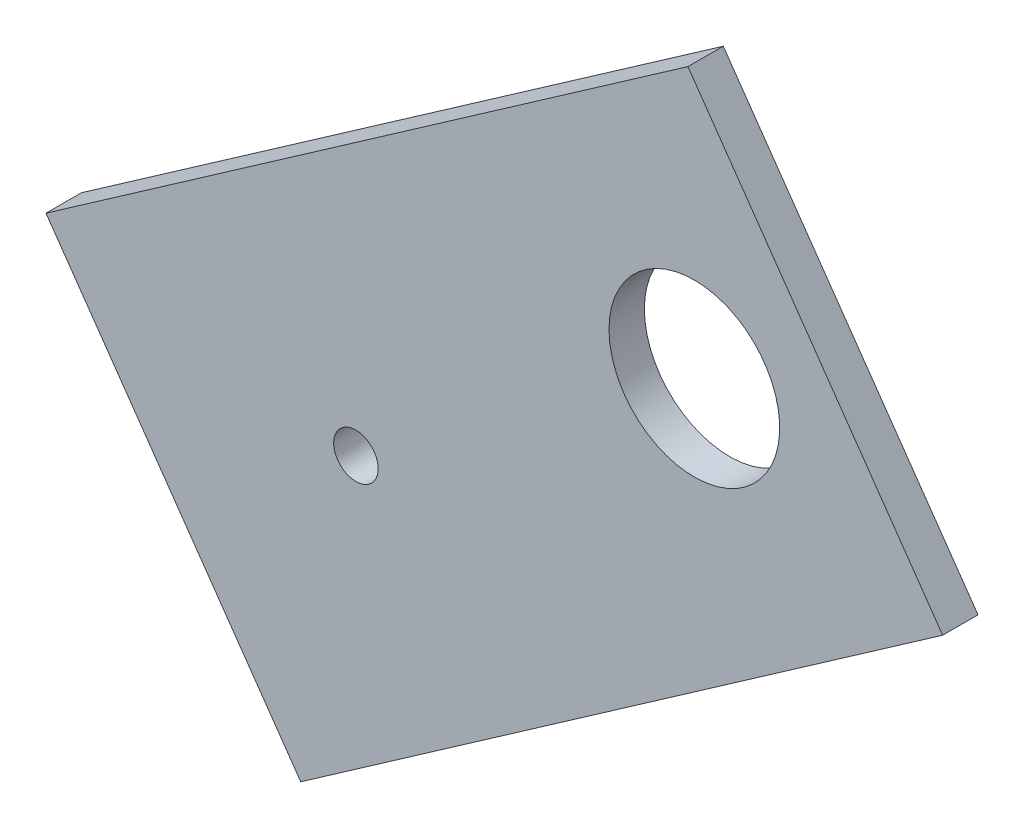
ISO-10303-21;
HEADER;
FILE_DESCRIPTION(('STEP AP214'),'2;1');
FILE_NAME('part.step','',(''),(''),'','','');
FILE_SCHEMA(('AUTOMOTIVE_DESIGN { 1 0 10303 214 1 1 1 1 }'));
ENDSEC;
DATA;
#1=APPLICATION_CONTEXT('core data for automotive mechanical design processes');
#2=APPLICATION_PROTOCOL_DEFINITION('international standard','automotive_design',2000,#1);
#3=PRODUCT_CONTEXT('',#1,'mechanical');
#4=PRODUCT('Part','Part','',(#3));
#5=PRODUCT_RELATED_PRODUCT_CATEGORY('part','',(#4));
#6=PRODUCT_DEFINITION_FORMATION('','',#4);
#7=PRODUCT_DEFINITION_CONTEXT('part definition',#1,'design');
#8=PRODUCT_DEFINITION('design','',#6,#7);
#9=PRODUCT_DEFINITION_SHAPE('','',#8);
#10=(LENGTH_UNIT() NAMED_UNIT(*) SI_UNIT(.MILLI.,.METRE.));
#11=(NAMED_UNIT(*) PLANE_ANGLE_UNIT() SI_UNIT($,.RADIAN.));
#12=(NAMED_UNIT(*) SI_UNIT($,.STERADIAN.) SOLID_ANGLE_UNIT());
#13=UNCERTAINTY_MEASURE_WITH_UNIT(LENGTH_MEASURE(1.E-05),#10,'distance_accuracy_value','');
#14=(GEOMETRIC_REPRESENTATION_CONTEXT(3) GLOBAL_UNCERTAINTY_ASSIGNED_CONTEXT((#13)) GLOBAL_UNIT_ASSIGNED_CONTEXT((#10,
#11,#12)) REPRESENTATION_CONTEXT('',''));
#15=CARTESIAN_POINT('',(0.,0.,0.));
#16=DIRECTION('',(0.,0.,1.));
#17=DIRECTION('',(1.,0.,0.));
#18=AXIS2_PLACEMENT_3D('',#15,#16,#17);
#19=CARTESIAN_POINT('',(56.2685478848419,15.9477071068351,4.7625));
#20=DIRECTION('',(0.,0.,-1.));
#21=DIRECTION('',(-1.,0.,0.));
#22=AXIS2_PLACEMENT_3D('',#19,#20,#21);
#23=PLANE('',#22);
#24=CARTESIAN_POINT('',(-22.8117586450122,-2.64680611698764,4.7625));
#25=DIRECTION('',(0.,0.,1.));
#26=DIRECTION('',(1.,0.,0.));
#27=AXIS2_PLACEMENT_3D('',#24,#25,#26);
#28=CIRCLE('',#27,3.00000000000001);
#29=CARTESIAN_POINT('',(-25.8117586450122,-2.64680611698764,4.7625));
#30=VERTEX_POINT('',#29);
#31=EDGE_CURVE('E100',#30,#30,#28,.T.);
#32=ORIENTED_EDGE('',*,*,#31,.F.);
#33=EDGE_LOOP('',(#32));
#34=FACE_BOUND('',#33,.T.);
#35=DIRECTION('',(-0.57219860235716,0.820115089155487,0.));
#36=VECTOR('',#35,1.);
#37=CARTESIAN_POINT('',(21.9366317434122,65.1546124561644,4.7625));
#38=LINE('',#37,#36);
#39=CARTESIAN_POINT('',(56.2685478848419,15.9477071068351,4.7625));
#40=VERTEX_POINT('',#39);
#41=CARTESIAN_POINT('',(21.9366317434122,65.1546124561644,4.7625));
#42=VERTEX_POINT('',#41);
#43=EDGE_CURVE('E85',#40,#42,#38,.T.);
#44=ORIENTED_EDGE('',*,*,#43,.T.);
#45=DIRECTION('',(-0.820115089155487,-0.57219860235716,0.));
#46=VECTOR('',#45,1.);
#47=CARTESIAN_POINT('',(21.9366317434122,65.1546124561644,4.7625));
#48=LINE('',#47,#46);
#49=CARTESIAN_POINT('',(-64.5811693903917,4.79068848696215,4.7625));
#50=VERTEX_POINT('',#49);
#51=EDGE_CURVE('E80',#42,#50,#48,.T.);
#52=ORIENTED_EDGE('',*,*,#51,.T.);
#53=DIRECTION('',(0.572198602357158,-0.820115089155489,0.));
#54=VECTOR('',#53,1.);
#55=CARTESIAN_POINT('',(-64.5811693903917,4.79068848696215,4.7625));
#56=LINE('',#55,#54);
#57=CARTESIAN_POINT('',(-30.2492532489622,-44.4162168623672,4.7625));
#58=VERTEX_POINT('',#57);
#59=EDGE_CURVE('E83',#50,#58,#56,.T.);
#60=ORIENTED_EDGE('',*,*,#59,.T.);
#61=DIRECTION('',(0.820115089155487,0.572198602357161,0.));
#62=VECTOR('',#61,1.);
#63=CARTESIAN_POINT('',(56.2685478848419,15.9477071068351,4.7625));
#64=LINE('',#63,#62);
#65=EDGE_CURVE('E50',#58,#40,#64,.T.);
#66=ORIENTED_EDGE('',*,*,#65,.T.);
#67=EDGE_LOOP('',(#44,#52,#60,#66));
#68=FACE_BOUND('',#67,.T.);
#69=CARTESIAN_POINT('',(22.8000259739106,29.1767754206218,4.7625));
#70=DIRECTION('',(0.,0.,1.));
#71=DIRECTION('',(1.,0.,0.));
#72=AXIS2_PLACEMENT_3D('',#69,#70,#71);
#73=CIRCLE('',#72,11.5);
#74=CARTESIAN_POINT('',(11.3000259739106,29.1767754206218,4.7625));
#75=VERTEX_POINT('',#74);
#76=EDGE_CURVE('E115',#75,#75,#73,.T.);
#77=ORIENTED_EDGE('',*,*,#76,.F.);
#78=EDGE_LOOP('',(#77));
#79=FACE_BOUND('',#78,.T.);
#80=ADVANCED_FACE('F33',(#34,#68,#79),#23,.F.);
#81=CARTESIAN_POINT('',(56.2685478848419,15.9477071068351,0.));
#82=DIRECTION('',(0.,0.,-1.));
#83=DIRECTION('',(-1.,0.,0.));
#84=AXIS2_PLACEMENT_3D('',#81,#82,#83);
#85=PLANE('',#84);
#86=CARTESIAN_POINT('',(-22.8117586450122,-2.64680611698764,0.));
#87=DIRECTION('',(0.,0.,1.));
#88=DIRECTION('',(1.,0.,0.));
#89=AXIS2_PLACEMENT_3D('',#86,#87,#88);
#90=CIRCLE('',#89,3.00000000000001);
#91=CARTESIAN_POINT('',(-25.8117586450122,-2.64680611698764,0.));
#92=VERTEX_POINT('',#91);
#93=EDGE_CURVE('E112',#92,#92,#90,.T.);
#94=ORIENTED_EDGE('',*,*,#93,.T.);
#95=EDGE_LOOP('',(#94));
#96=FACE_BOUND('',#95,.T.);
#97=DIRECTION('',(-0.57219860235716,0.820115089155487,0.));
#98=VECTOR('',#97,1.);
#99=CARTESIAN_POINT('',(21.9366317434122,65.1546124561644,0.));
#100=LINE('',#99,#98);
#101=CARTESIAN_POINT('',(56.2685478848419,15.9477071068351,0.));
#102=VERTEX_POINT('',#101);
#103=CARTESIAN_POINT('',(21.9366317434122,65.1546124561644,0.));
#104=VERTEX_POINT('',#103);
#105=EDGE_CURVE('E97',#102,#104,#100,.T.);
#106=ORIENTED_EDGE('',*,*,#105,.F.);
#107=DIRECTION('',(0.820115089155487,0.572198602357161,0.));
#108=VECTOR('',#107,1.);
#109=CARTESIAN_POINT('',(56.2685478848419,15.9477071068351,0.));
#110=LINE('',#109,#108);
#111=CARTESIAN_POINT('',(-30.2492532489622,-44.4162168623672,0.));
#112=VERTEX_POINT('',#111);
#113=EDGE_CURVE('E73',#112,#102,#110,.T.);
#114=ORIENTED_EDGE('',*,*,#113,.F.);
#115=DIRECTION('',(0.572198602357158,-0.820115089155489,0.));
#116=VECTOR('',#115,1.);
#117=CARTESIAN_POINT('',(-64.5811693903917,4.79068848696215,0.));
#118=LINE('',#117,#116);
#119=CARTESIAN_POINT('',(-64.5811693903917,4.79068848696215,0.));
#120=VERTEX_POINT('',#119);
#121=EDGE_CURVE('E67',#120,#112,#118,.T.);
#122=ORIENTED_EDGE('',*,*,#121,.F.);
#123=DIRECTION('',(-0.820115089155487,-0.57219860235716,0.));
#124=VECTOR('',#123,1.);
#125=CARTESIAN_POINT('',(21.9366317434122,65.1546124561644,0.));
#126=LINE('',#125,#124);
#127=EDGE_CURVE('E89',#104,#120,#126,.T.);
#128=ORIENTED_EDGE('',*,*,#127,.F.);
#129=EDGE_LOOP('',(#106,#114,#122,#128));
#130=FACE_BOUND('',#129,.T.);
#131=CARTESIAN_POINT('',(22.8000259739106,29.1767754206218,0.));
#132=DIRECTION('',(0.,0.,1.));
#133=DIRECTION('',(1.,0.,0.));
#134=AXIS2_PLACEMENT_3D('',#131,#132,#133);
#135=CIRCLE('',#134,11.5);
#136=CARTESIAN_POINT('',(11.3000259739106,29.1767754206218,0.));
#137=VERTEX_POINT('',#136);
#138=EDGE_CURVE('E118',#137,#137,#135,.T.);
#139=ORIENTED_EDGE('',*,*,#138,.T.);
#140=EDGE_LOOP('',(#139));
#141=FACE_BOUND('',#140,.T.);
#142=ADVANCED_FACE('F108',(#96,#130,#141),#85,.T.);
#143=CARTESIAN_POINT('',(21.9366317434122,65.1546124561644,4.7625));
#144=DIRECTION('',(-0.820115089155487,-0.57219860235716,0.));
#145=DIRECTION('',(0.57219860235716,-0.820115089155487,0.));
#146=AXIS2_PLACEMENT_3D('',#143,#144,#145);
#147=PLANE('',#146);
#148=ORIENTED_EDGE('',*,*,#105,.T.);
#149=DIRECTION('',(0.,0.,-1.));
#150=VECTOR('',#149,1.);
#151=CARTESIAN_POINT('',(21.9366317434122,65.1546124561644,4.7625));
#152=LINE('',#151,#150);
#153=EDGE_CURVE('E11',#42,#104,#152,.T.);
#154=ORIENTED_EDGE('',*,*,#153,.F.);
#155=ORIENTED_EDGE('',*,*,#43,.F.);
#156=DIRECTION('',(0.,0.,-1.));
#157=VECTOR('',#156,1.);
#158=CARTESIAN_POINT('',(56.2685478848419,15.9477071068351,4.7625));
#159=LINE('',#158,#157);
#160=EDGE_CURVE('E93',#40,#102,#159,.T.);
#161=ORIENTED_EDGE('',*,*,#160,.T.);
#162=EDGE_LOOP('',(#148,#154,#155,#161));
#163=FACE_BOUND('',#162,.T.);
#164=ADVANCED_FACE('F35',(#163),#147,.F.);
#165=CARTESIAN_POINT('',(21.9366317434122,65.1546124561644,4.7625));
#166=DIRECTION('',(0.57219860235716,-0.820115089155487,0.));
#167=DIRECTION('',(0.820115089155487,0.57219860235716,0.));
#168=AXIS2_PLACEMENT_3D('',#165,#166,#167);
#169=PLANE('',#168);
#170=ORIENTED_EDGE('',*,*,#127,.T.);
#171=DIRECTION('',(0.,0.,-1.));
#172=VECTOR('',#171,1.);
#173=CARTESIAN_POINT('',(-64.5811693903917,4.79068848696215,4.7625));
#174=LINE('',#173,#172);
#175=EDGE_CURVE('E42',#50,#120,#174,.T.);
#176=ORIENTED_EDGE('',*,*,#175,.F.);
#177=ORIENTED_EDGE('',*,*,#51,.F.);
#178=ORIENTED_EDGE('',*,*,#153,.T.);
#179=EDGE_LOOP('',(#170,#176,#177,#178));
#180=FACE_BOUND('',#179,.T.);
#181=ADVANCED_FACE('F88',(#180),#169,.F.);
#182=CARTESIAN_POINT('',(-64.5811693903917,4.79068848696215,4.7625));
#183=DIRECTION('',(0.820115089155489,0.572198602357158,0.));
#184=DIRECTION('',(-0.572198602357158,0.820115089155489,0.));
#185=AXIS2_PLACEMENT_3D('',#182,#183,#184);
#186=PLANE('',#185);
#187=ORIENTED_EDGE('',*,*,#121,.T.);
#188=DIRECTION('',(0.,0.,-1.));
#189=VECTOR('',#188,1.);
#190=CARTESIAN_POINT('',(-30.2492532489622,-44.4162168623672,4.7625));
#191=LINE('',#190,#189);
#192=EDGE_CURVE('E90',#58,#112,#191,.T.);
#193=ORIENTED_EDGE('',*,*,#192,.F.);
#194=ORIENTED_EDGE('',*,*,#59,.F.);
#195=ORIENTED_EDGE('',*,*,#175,.T.);
#196=EDGE_LOOP('',(#187,#193,#194,#195));
#197=FACE_BOUND('',#196,.T.);
#198=ADVANCED_FACE('F91',(#197),#186,.F.);
#199=CARTESIAN_POINT('',(56.2685478848419,15.9477071068351,4.7625));
#200=DIRECTION('',(-0.57219860235716,0.820115089155487,0.));
#201=DIRECTION('',(-0.820115089155487,-0.57219860235716,0.));
#202=AXIS2_PLACEMENT_3D('',#199,#200,#201);
#203=PLANE('',#202);
#204=ORIENTED_EDGE('',*,*,#113,.T.);
#205=ORIENTED_EDGE('',*,*,#160,.F.);
#206=ORIENTED_EDGE('',*,*,#65,.F.);
#207=ORIENTED_EDGE('',*,*,#192,.T.);
#208=EDGE_LOOP('',(#204,#205,#206,#207));
#209=FACE_BOUND('',#208,.T.);
#210=ADVANCED_FACE('F105',(#209),#203,.F.);
#211=CARTESIAN_POINT('',(-22.8117586450122,-2.64680611698764,4.7625));
#212=DIRECTION('',(0.,0.,-1.));
#213=DIRECTION('',(-1.,0.,0.));
#214=AXIS2_PLACEMENT_3D('',#211,#212,#213);
#215=CYLINDRICAL_SURFACE('',#214,3.00000000000001);
#216=CARTESIAN_POINT('',(-25.8117586450122,-2.64680611698764,4.7625));
#217=CARTESIAN_POINT('',(-25.8117586450122,-2.64680611698764,4.712890625));
#218=CARTESIAN_POINT('',(-25.8117586450122,-2.64680611698764,4.66328125));
#219=CARTESIAN_POINT('',(-25.8117586450122,-2.64680611698764,4.5640625));
#220=CARTESIAN_POINT('',(-25.8117586450122,-2.64680611698764,4.514453125));
#221=CARTESIAN_POINT('',(-25.8117586450122,-2.64680611698764,4.415234375));
#222=CARTESIAN_POINT('',(-25.8117586450122,-2.64680611698764,4.365625));
#223=CARTESIAN_POINT('',(-25.8117586450122,-2.64680611698764,4.26640625));
#224=CARTESIAN_POINT('',(-25.8117586450122,-2.64680611698764,4.216796875));
#225=CARTESIAN_POINT('',(-25.8117586450122,-2.64680611698764,4.117578125));
#226=CARTESIAN_POINT('',(-25.8117586450122,-2.64680611698764,4.06796875));
#227=CARTESIAN_POINT('',(-25.8117586450122,-2.64680611698764,3.96875));
#228=CARTESIAN_POINT('',(-25.8117586450122,-2.64680611698764,3.919140625));
#229=CARTESIAN_POINT('',(-25.8117586450122,-2.64680611698764,3.819921875));
#230=CARTESIAN_POINT('',(-25.8117586450122,-2.64680611698764,3.7703125));
#231=CARTESIAN_POINT('',(-25.8117586450122,-2.64680611698764,3.67109375));
#232=CARTESIAN_POINT('',(-25.8117586450122,-2.64680611698764,3.621484375));
#233=CARTESIAN_POINT('',(-25.8117586450122,-2.64680611698764,3.522265625));
#234=CARTESIAN_POINT('',(-25.8117586450122,-2.64680611698764,3.47265625));
#235=CARTESIAN_POINT('',(-25.8117586450122,-2.64680611698764,3.3734375));
#236=CARTESIAN_POINT('',(-25.8117586450122,-2.64680611698764,3.323828125));
#237=CARTESIAN_POINT('',(-25.8117586450122,-2.64680611698764,3.224609375));
#238=CARTESIAN_POINT('',(-25.8117586450122,-2.64680611698764,3.175));
#239=CARTESIAN_POINT('',(-25.8117586450122,-2.64680611698764,3.07578125));
#240=CARTESIAN_POINT('',(-25.8117586450122,-2.64680611698764,3.026171875));
#241=CARTESIAN_POINT('',(-25.8117586450122,-2.64680611698764,2.926953125));
#242=CARTESIAN_POINT('',(-25.8117586450122,-2.64680611698764,2.87734375));
#243=CARTESIAN_POINT('',(-25.8117586450122,-2.64680611698764,2.778125));
#244=CARTESIAN_POINT('',(-25.8117586450122,-2.64680611698764,2.728515625));
#245=CARTESIAN_POINT('',(-25.8117586450122,-2.64680611698764,2.629296875));
#246=CARTESIAN_POINT('',(-25.8117586450122,-2.64680611698764,2.5796875));
#247=CARTESIAN_POINT('',(-25.8117586450122,-2.64680611698764,2.48046875));
#248=CARTESIAN_POINT('',(-25.8117586450122,-2.64680611698764,2.430859375));
#249=CARTESIAN_POINT('',(-25.8117586450122,-2.64680611698764,2.331640625));
#250=CARTESIAN_POINT('',(-25.8117586450122,-2.64680611698764,2.28203125));
#251=CARTESIAN_POINT('',(-25.8117586450122,-2.64680611698764,2.1828125));
#252=CARTESIAN_POINT('',(-25.8117586450122,-2.64680611698764,2.133203125));
#253=CARTESIAN_POINT('',(-25.8117586450122,-2.64680611698764,2.033984375));
#254=CARTESIAN_POINT('',(-25.8117586450122,-2.64680611698764,1.984375));
#255=CARTESIAN_POINT('',(-25.8117586450122,-2.64680611698764,1.88515625));
#256=CARTESIAN_POINT('',(-25.8117586450122,-2.64680611698764,1.835546875));
#257=CARTESIAN_POINT('',(-25.8117586450122,-2.64680611698764,1.736328125));
#258=CARTESIAN_POINT('',(-25.8117586450122,-2.64680611698764,1.68671875));
#259=CARTESIAN_POINT('',(-25.8117586450122,-2.64680611698764,1.5875));
#260=CARTESIAN_POINT('',(-25.8117586450122,-2.64680611698764,1.537890625));
#261=CARTESIAN_POINT('',(-25.8117586450122,-2.64680611698764,1.438671875));
#262=CARTESIAN_POINT('',(-25.8117586450122,-2.64680611698764,1.3890625));
#263=CARTESIAN_POINT('',(-25.8117586450122,-2.64680611698764,1.28984375));
#264=CARTESIAN_POINT('',(-25.8117586450122,-2.64680611698764,1.240234375));
#265=CARTESIAN_POINT('',(-25.8117586450122,-2.64680611698764,1.141015625));
#266=CARTESIAN_POINT('',(-25.8117586450122,-2.64680611698764,1.09140625));
#267=CARTESIAN_POINT('',(-25.8117586450122,-2.64680611698764,0.992187499999999));
#268=CARTESIAN_POINT('',(-25.8117586450122,-2.64680611698764,0.942578124999999));
#269=CARTESIAN_POINT('',(-25.8117586450122,-2.64680611698764,0.843359375));
#270=CARTESIAN_POINT('',(-25.8117586450122,-2.64680611698764,0.79375));
#271=CARTESIAN_POINT('',(-25.8117586450122,-2.64680611698764,0.69453125));
#272=CARTESIAN_POINT('',(-25.8117586450122,-2.64680611698764,0.644921875));
#273=CARTESIAN_POINT('',(-25.8117586450122,-2.64680611698764,0.545703125));
#274=CARTESIAN_POINT('',(-25.8117586450122,-2.64680611698764,0.49609375));
#275=CARTESIAN_POINT('',(-25.8117586450122,-2.64680611698764,0.396875));
#276=CARTESIAN_POINT('',(-25.8117586450122,-2.64680611698764,0.347265625));
#277=CARTESIAN_POINT('',(-25.8117586450122,-2.64680611698764,0.248046875));
#278=CARTESIAN_POINT('',(-25.8117586450122,-2.64680611698764,0.1984375));
#279=CARTESIAN_POINT('',(-25.8117586450122,-2.64680611698764,0.09921875));
#280=CARTESIAN_POINT('',(-25.8117586450122,-2.64680611698764,0.049609375));
#281=CARTESIAN_POINT('',(-25.8117586450122,-2.64680611698764,0.));
#282=B_SPLINE_CURVE_WITH_KNOTS('',3,(#216,#217,#218,#219,#220,#221,#222,#223,#224,#225,#226,
#227,#228,#229,#230,#231,#232,#233,#234,#235,#236,#237,#238,#239,#240,#241,#242,#243,#244,#245,
#246,#247,#248,#249,#250,#251,#252,#253,#254,#255,#256,#257,#258,#259,#260,#261,#262,#263,#264,
#265,#266,#267,#268,#269,#270,#271,#272,#273,#274,#275,#276,#277,#278,#279,#280,#281),
.UNSPECIFIED.,.F.,.F.,(4,2,2,2,2,2,2,2,2,2,2,2,2,2,2,2,2,2,2,2,2,2,2,2,2,2,2,2,2,2,2,2,4),(0.,
0.148828125,0.29765625,0.446484375,0.5953125,0.744140625,0.892968750000001,1.041796875,1.190625,
1.339453125,1.48828125,1.637109375,1.7859375,1.934765625,2.08359375,2.232421875,2.38125,
2.530078125,2.67890625,2.827734375,2.9765625,3.125390625,3.27421875,3.423046875,3.571875,
3.720703125,3.86953125,4.018359375,4.1671875,4.316015625,4.46484375,4.613671875,4.7625),.UNSPECIFIED.);
#283=EDGE_CURVE('BSEAM136',#30,#92,#282,.T.);
#284=ORIENTED_EDGE('',*,*,#31,.T.);
#285=ORIENTED_EDGE('',*,*,#93,.F.);
#286=ORIENTED_EDGE('',*,*,#283,.T.);
#287=ORIENTED_EDGE('',*,*,#283,.F.);
#288=EDGE_LOOP('',(#284,#286,#285,#287));
#289=FACE_BOUND('',#288,.T.);
#290=ADVANCED_FACE('F136',(#289),#215,.F.);
#291=CARTESIAN_POINT('',(22.8000259739106,29.1767754206218,4.7625));
#292=DIRECTION('',(0.,0.,-1.));
#293=DIRECTION('',(-1.,0.,0.));
#294=AXIS2_PLACEMENT_3D('',#291,#292,#293);
#295=CYLINDRICAL_SURFACE('',#294,11.5);
#296=CARTESIAN_POINT('',(11.3000259739106,29.1767754206218,4.7625));
#297=CARTESIAN_POINT('',(11.3000259739106,29.1767754206218,4.712890625));
#298=CARTESIAN_POINT('',(11.3000259739106,29.1767754206218,4.66328125));
#299=CARTESIAN_POINT('',(11.3000259739106,29.1767754206218,4.5640625));
#300=CARTESIAN_POINT('',(11.3000259739106,29.1767754206218,4.514453125));
#301=CARTESIAN_POINT('',(11.3000259739106,29.1767754206218,4.415234375));
#302=CARTESIAN_POINT('',(11.3000259739106,29.1767754206218,4.365625));
#303=CARTESIAN_POINT('',(11.3000259739106,29.1767754206218,4.26640625));
#304=CARTESIAN_POINT('',(11.3000259739106,29.1767754206218,4.216796875));
#305=CARTESIAN_POINT('',(11.3000259739106,29.1767754206218,4.117578125));
#306=CARTESIAN_POINT('',(11.3000259739106,29.1767754206218,4.06796875));
#307=CARTESIAN_POINT('',(11.3000259739106,29.1767754206218,3.96875));
#308=CARTESIAN_POINT('',(11.3000259739106,29.1767754206218,3.919140625));
#309=CARTESIAN_POINT('',(11.3000259739106,29.1767754206218,3.819921875));
#310=CARTESIAN_POINT('',(11.3000259739106,29.1767754206218,3.7703125));
#311=CARTESIAN_POINT('',(11.3000259739106,29.1767754206218,3.67109375));
#312=CARTESIAN_POINT('',(11.3000259739106,29.1767754206218,3.621484375));
#313=CARTESIAN_POINT('',(11.3000259739106,29.1767754206218,3.522265625));
#314=CARTESIAN_POINT('',(11.3000259739106,29.1767754206218,3.47265625));
#315=CARTESIAN_POINT('',(11.3000259739106,29.1767754206218,3.3734375));
#316=CARTESIAN_POINT('',(11.3000259739106,29.1767754206218,3.323828125));
#317=CARTESIAN_POINT('',(11.3000259739106,29.1767754206218,3.224609375));
#318=CARTESIAN_POINT('',(11.3000259739106,29.1767754206218,3.175));
#319=CARTESIAN_POINT('',(11.3000259739106,29.1767754206218,3.07578125));
#320=CARTESIAN_POINT('',(11.3000259739106,29.1767754206218,3.026171875));
#321=CARTESIAN_POINT('',(11.3000259739106,29.1767754206218,2.926953125));
#322=CARTESIAN_POINT('',(11.3000259739106,29.1767754206218,2.87734375));
#323=CARTESIAN_POINT('',(11.3000259739106,29.1767754206218,2.778125));
#324=CARTESIAN_POINT('',(11.3000259739106,29.1767754206218,2.728515625));
#325=CARTESIAN_POINT('',(11.3000259739106,29.1767754206218,2.629296875));
#326=CARTESIAN_POINT('',(11.3000259739106,29.1767754206218,2.5796875));
#327=CARTESIAN_POINT('',(11.3000259739106,29.1767754206218,2.48046875));
#328=CARTESIAN_POINT('',(11.3000259739106,29.1767754206218,2.430859375));
#329=CARTESIAN_POINT('',(11.3000259739106,29.1767754206218,2.331640625));
#330=CARTESIAN_POINT('',(11.3000259739106,29.1767754206218,2.28203125));
#331=CARTESIAN_POINT('',(11.3000259739106,29.1767754206218,2.1828125));
#332=CARTESIAN_POINT('',(11.3000259739106,29.1767754206218,2.133203125));
#333=CARTESIAN_POINT('',(11.3000259739106,29.1767754206218,2.033984375));
#334=CARTESIAN_POINT('',(11.3000259739106,29.1767754206218,1.984375));
#335=CARTESIAN_POINT('',(11.3000259739106,29.1767754206218,1.88515625));
#336=CARTESIAN_POINT('',(11.3000259739106,29.1767754206218,1.835546875));
#337=CARTESIAN_POINT('',(11.3000259739106,29.1767754206218,1.736328125));
#338=CARTESIAN_POINT('',(11.3000259739106,29.1767754206218,1.68671875));
#339=CARTESIAN_POINT('',(11.3000259739106,29.1767754206218,1.5875));
#340=CARTESIAN_POINT('',(11.3000259739106,29.1767754206218,1.537890625));
#341=CARTESIAN_POINT('',(11.3000259739106,29.1767754206218,1.438671875));
#342=CARTESIAN_POINT('',(11.3000259739106,29.1767754206218,1.3890625));
#343=CARTESIAN_POINT('',(11.3000259739106,29.1767754206218,1.28984375));
#344=CARTESIAN_POINT('',(11.3000259739106,29.1767754206218,1.240234375));
#345=CARTESIAN_POINT('',(11.3000259739106,29.1767754206218,1.141015625));
#346=CARTESIAN_POINT('',(11.3000259739106,29.1767754206218,1.09140625));
#347=CARTESIAN_POINT('',(11.3000259739106,29.1767754206218,0.9921875));
#348=CARTESIAN_POINT('',(11.3000259739106,29.1767754206218,0.942578125));
#349=CARTESIAN_POINT('',(11.3000259739106,29.1767754206218,0.843359375));
#350=CARTESIAN_POINT('',(11.3000259739106,29.1767754206218,0.79375));
#351=CARTESIAN_POINT('',(11.3000259739106,29.1767754206218,0.69453125));
#352=CARTESIAN_POINT('',(11.3000259739106,29.1767754206218,0.644921875));
#353=CARTESIAN_POINT('',(11.3000259739106,29.1767754206218,0.545703125));
#354=CARTESIAN_POINT('',(11.3000259739106,29.1767754206218,0.49609375));
#355=CARTESIAN_POINT('',(11.3000259739106,29.1767754206218,0.396875));
#356=CARTESIAN_POINT('',(11.3000259739106,29.1767754206218,0.347265625));
#357=CARTESIAN_POINT('',(11.3000259739106,29.1767754206218,0.248046875));
#358=CARTESIAN_POINT('',(11.3000259739106,29.1767754206218,0.1984375));
#359=CARTESIAN_POINT('',(11.3000259739106,29.1767754206218,0.09921875));
#360=CARTESIAN_POINT('',(11.3000259739106,29.1767754206218,0.049609375));
#361=CARTESIAN_POINT('',(11.3000259739106,29.1767754206218,0.));
#362=B_SPLINE_CURVE_WITH_KNOTS('',3,(#296,#297,#298,#299,#300,#301,#302,#303,#304,#305,#306,
#307,#308,#309,#310,#311,#312,#313,#314,#315,#316,#317,#318,#319,#320,#321,#322,#323,#324,#325,
#326,#327,#328,#329,#330,#331,#332,#333,#334,#335,#336,#337,#338,#339,#340,#341,#342,#343,#344,
#345,#346,#347,#348,#349,#350,#351,#352,#353,#354,#355,#356,#357,#358,#359,#360,#361),
.UNSPECIFIED.,.F.,.F.,(4,2,2,2,2,2,2,2,2,2,2,2,2,2,2,2,2,2,2,2,2,2,2,2,2,2,2,2,2,2,2,2,4),(0.,
0.148828124999999,0.297656249999999,0.446484374999999,0.595312499999999,0.744140625,0.89296875,
1.041796875,1.190625,1.339453125,1.48828125,1.637109375,1.7859375,1.934765625,2.08359375,
2.232421875,2.38125,2.530078125,2.67890625,2.827734375,2.9765625,3.125390625,3.27421875,
3.423046875,3.571875,3.720703125,3.86953125,4.018359375,4.1671875,4.316015625,4.46484375,
4.613671875,4.7625),.UNSPECIFIED.);
#363=EDGE_CURVE('BSEAM124',#75,#137,#362,.T.);
#364=ORIENTED_EDGE('',*,*,#76,.T.);
#365=ORIENTED_EDGE('',*,*,#138,.F.);
#366=ORIENTED_EDGE('',*,*,#363,.T.);
#367=ORIENTED_EDGE('',*,*,#363,.F.);
#368=EDGE_LOOP('',(#364,#366,#365,#367));
#369=FACE_BOUND('',#368,.T.);
#370=ADVANCED_FACE('F124',(#369),#295,.F.);
#371=CLOSED_SHELL('',(#80,#142,#164,#181,#198,#210,#290,#370));
#372=MANIFOLD_SOLID_BREP('B2',#371);
#373=ADVANCED_BREP_SHAPE_REPRESENTATION('',(#18,#372),#14);
#374=SHAPE_DEFINITION_REPRESENTATION(#9,#373);
ENDSEC;
END-ISO-10303-21;
